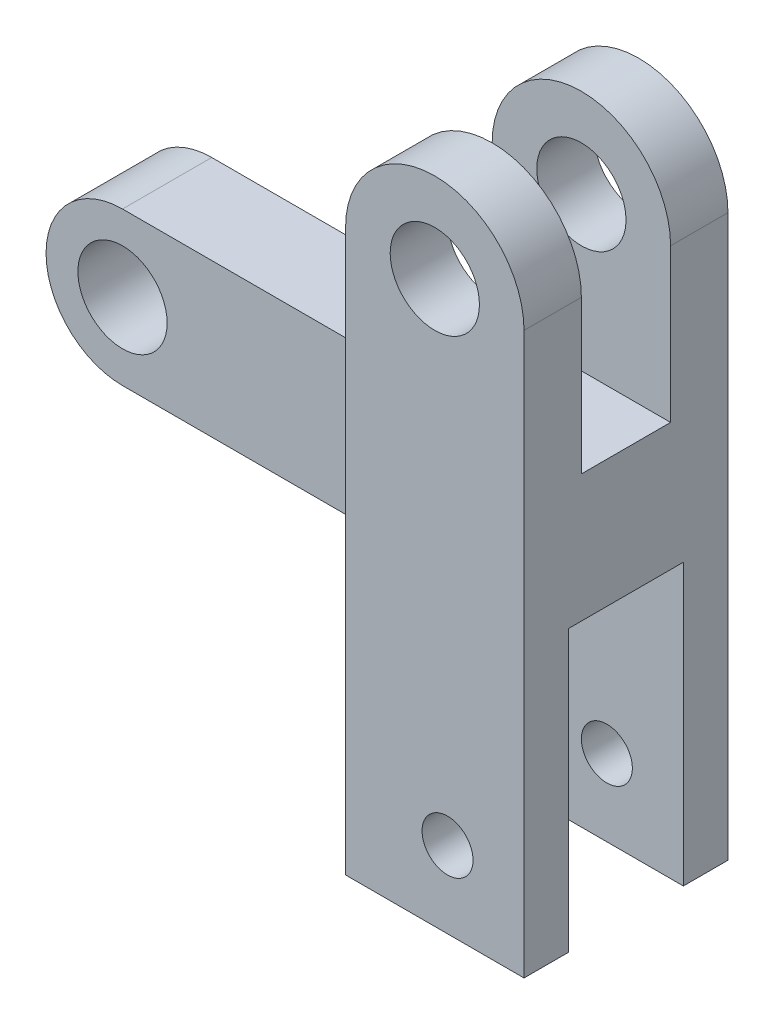
ISO-10303-21;
HEADER;
FILE_DESCRIPTION(('STEP AP214'),'2;1');
FILE_NAME('part.step','',(''),(''),'','','');
FILE_SCHEMA(('AUTOMOTIVE_DESIGN { 1 0 10303 214 1 1 1 1 }'));
ENDSEC;
DATA;
#1=APPLICATION_CONTEXT('core data for automotive mechanical design processes');
#2=APPLICATION_PROTOCOL_DEFINITION('international standard','automotive_design',2000,#1);
#3=PRODUCT_CONTEXT('',#1,'mechanical');
#4=PRODUCT('Part','Part','',(#3));
#5=PRODUCT_RELATED_PRODUCT_CATEGORY('part','',(#4));
#6=PRODUCT_DEFINITION_FORMATION('','',#4);
#7=PRODUCT_DEFINITION_CONTEXT('part definition',#1,'design');
#8=PRODUCT_DEFINITION('design','',#6,#7);
#9=PRODUCT_DEFINITION_SHAPE('','',#8);
#10=(LENGTH_UNIT() NAMED_UNIT(*) SI_UNIT(.MILLI.,.METRE.));
#11=(NAMED_UNIT(*) PLANE_ANGLE_UNIT() SI_UNIT($,.RADIAN.));
#12=(NAMED_UNIT(*) SI_UNIT($,.STERADIAN.) SOLID_ANGLE_UNIT());
#13=UNCERTAINTY_MEASURE_WITH_UNIT(LENGTH_MEASURE(1.E-05),#10,'distance_accuracy_value','');
#14=(GEOMETRIC_REPRESENTATION_CONTEXT(3) GLOBAL_UNCERTAINTY_ASSIGNED_CONTEXT((#13)) GLOBAL_UNIT_ASSIGNED_CONTEXT((#10,
#11,#12)) REPRESENTATION_CONTEXT('',''));
#15=CARTESIAN_POINT('',(0.,0.,0.));
#16=DIRECTION('',(0.,0.,1.));
#17=DIRECTION('',(1.,0.,0.));
#18=AXIS2_PLACEMENT_3D('',#15,#16,#17);
#19=CARTESIAN_POINT('',(0.,2.4,-3.5));
#20=DIRECTION('',(1.,0.,0.));
#21=DIRECTION('',(0.,0.,-1.));
#22=AXIS2_PLACEMENT_3D('',#19,#20,#21);
#23=PLANE('',#22);
#24=DIRECTION('',(0.,-1.,0.));
#25=VECTOR('',#24,1.);
#26=CARTESIAN_POINT('',(0.,-0.999999999999997,2.25));
#27=LINE('',#26,#25);
#28=CARTESIAN_POINT('',(0.,-0.999999999999997,2.25));
#29=VERTEX_POINT('',#28);
#30=CARTESIAN_POINT('',(0.,-12.,2.25));
#31=VERTEX_POINT('',#30);
#32=EDGE_CURVE('E239',#29,#31,#27,.T.);
#33=ORIENTED_EDGE('',*,*,#32,.T.);
#34=DIRECTION('',(0.,0.,-1.));
#35=VECTOR('',#34,1.);
#36=CARTESIAN_POINT('',(0.,-12.,3.5));
#37=LINE('',#36,#35);
#38=CARTESIAN_POINT('',(0.,-12.,4.));
#39=VERTEX_POINT('',#38);
#40=EDGE_CURVE('E278',#39,#31,#37,.T.);
#41=ORIENTED_EDGE('',*,*,#40,.F.);
#42=DIRECTION('',(0.,-1.,0.));
#43=VECTOR('',#42,1.);
#44=CARTESIAN_POINT('',(0.,10.,4.));
#45=LINE('',#44,#43);
#46=CARTESIAN_POINT('',(0.,10.,4.));
#47=VERTEX_POINT('',#46);
#48=EDGE_CURVE('E212',#47,#39,#45,.T.);
#49=ORIENTED_EDGE('',*,*,#48,.F.);
#50=DIRECTION('',(0.,0.,1.));
#51=VECTOR('',#50,1.);
#52=CARTESIAN_POINT('',(0.,10.,1.75));
#53=LINE('',#52,#51);
#54=CARTESIAN_POINT('',(0.,10.,1.75));
#55=VERTEX_POINT('',#54);
#56=EDGE_CURVE('E296',#55,#47,#53,.T.);
#57=ORIENTED_EDGE('',*,*,#56,.F.);
#58=DIRECTION('',(0.,1.,0.));
#59=VECTOR('',#58,1.);
#60=CARTESIAN_POINT('',(0.,0.,1.75));
#61=LINE('',#60,#59);
#62=CARTESIAN_POINT('',(0.,4.,1.75));
#63=VERTEX_POINT('',#62);
#64=EDGE_CURVE('E285',#63,#55,#61,.T.);
#65=ORIENTED_EDGE('',*,*,#64,.F.);
#66=CARTESIAN_POINT('',(0.,-0.999999999999997,1.75));
#67=VERTEX_POINT('',#66);
#68=EDGE_CURVE('E290',#67,#63,#61,.T.);
#69=ORIENTED_EDGE('',*,*,#68,.F.);
#70=DIRECTION('',(0.,0.,1.));
#71=VECTOR('',#70,1.);
#72=CARTESIAN_POINT('',(0.,-0.999999999999997,2.25));
#73=LINE('',#72,#71);
#74=EDGE_CURVE('E221',#67,#29,#73,.T.);
#75=ORIENTED_EDGE('',*,*,#74,.T.);
#76=EDGE_LOOP('',(#33,#41,#49,#57,#65,#69,#75));
#77=FACE_BOUND('',#76,.T.);
#78=ADVANCED_FACE('F45',(#77),#23,.F.);
#79=DIRECTION('',(0.,-1.,0.));
#80=VECTOR('',#79,1.);
#81=CARTESIAN_POINT('',(0.,-0.999999999999997,-2.25));
#82=LINE('',#81,#80);
#83=CARTESIAN_POINT('',(0.,-0.999999999999997,-2.25));
#84=VERTEX_POINT('',#83);
#85=CARTESIAN_POINT('',(0.,-12.,-2.25));
#86=VERTEX_POINT('',#85);
#87=EDGE_CURVE('E228',#84,#86,#82,.T.);
#88=ORIENTED_EDGE('',*,*,#87,.F.);
#89=CARTESIAN_POINT('',(0.,-0.999999999999997,-1.75));
#90=VERTEX_POINT('',#89);
#91=EDGE_CURVE('E216',#84,#90,#73,.T.);
#92=ORIENTED_EDGE('',*,*,#91,.T.);
#93=DIRECTION('',(0.,1.,0.));
#94=VECTOR('',#93,1.);
#95=CARTESIAN_POINT('',(0.,0.,-1.75));
#96=LINE('',#95,#94);
#97=CARTESIAN_POINT('',(0.,4.,-1.75));
#98=VERTEX_POINT('',#97);
#99=EDGE_CURVE('E301',#90,#98,#96,.T.);
#100=ORIENTED_EDGE('',*,*,#99,.T.);
#101=CARTESIAN_POINT('',(0.,10.,-1.75));
#102=VERTEX_POINT('',#101);
#103=EDGE_CURVE('E298',#98,#102,#96,.T.);
#104=ORIENTED_EDGE('',*,*,#103,.T.);
#105=DIRECTION('',(0.,0.,-1.));
#106=VECTOR('',#105,1.);
#107=CARTESIAN_POINT('',(0.,10.,-1.75));
#108=LINE('',#107,#106);
#109=CARTESIAN_POINT('',(0.,10.,-4.));
#110=VERTEX_POINT('',#109);
#111=EDGE_CURVE('E169',#102,#110,#108,.T.);
#112=ORIENTED_EDGE('',*,*,#111,.T.);
#113=DIRECTION('',(0.,1.,0.));
#114=VECTOR('',#113,1.);
#115=CARTESIAN_POINT('',(0.,-12.,-4.));
#116=LINE('',#115,#114);
#117=CARTESIAN_POINT('',(0.,-12.,-4.));
#118=VERTEX_POINT('',#117);
#119=EDGE_CURVE('E187',#118,#110,#116,.T.);
#120=ORIENTED_EDGE('',*,*,#119,.F.);
#121=EDGE_CURVE('E277',#86,#118,#37,.T.);
#122=ORIENTED_EDGE('',*,*,#121,.F.);
#123=EDGE_LOOP('',(#88,#92,#100,#104,#112,#120,#122));
#124=FACE_BOUND('',#123,.T.);
#125=ADVANCED_FACE('F368',(#124),#23,.F.);
#126=CARTESIAN_POINT('',(7.,2.4,-3.5));
#127=DIRECTION('',(-1.,0.,0.));
#128=DIRECTION('',(0.,0.,1.));
#129=AXIS2_PLACEMENT_3D('',#126,#127,#128);
#130=PLANE('',#129);
#131=DIRECTION('',(0.,-1.,0.));
#132=VECTOR('',#131,1.);
#133=CARTESIAN_POINT('',(7.,-0.999999999999997,2.25));
#134=LINE('',#133,#132);
#135=CARTESIAN_POINT('',(7.,-0.999999999999997,2.25));
#136=VERTEX_POINT('',#135);
#137=CARTESIAN_POINT('',(7.,-12.,2.25));
#138=VERTEX_POINT('',#137);
#139=EDGE_CURVE('E237',#136,#138,#134,.T.);
#140=ORIENTED_EDGE('',*,*,#139,.F.);
#141=DIRECTION('',(0.,0.,-1.));
#142=VECTOR('',#141,1.);
#143=CARTESIAN_POINT('',(7.,-0.999999999999997,2.25));
#144=LINE('',#143,#142);
#145=CARTESIAN_POINT('',(7.,-0.999999999999997,-2.25));
#146=VERTEX_POINT('',#145);
#147=EDGE_CURVE('E223',#136,#146,#144,.T.);
#148=ORIENTED_EDGE('',*,*,#147,.T.);
#149=DIRECTION('',(0.,-1.,0.));
#150=VECTOR('',#149,1.);
#151=CARTESIAN_POINT('',(7.,-0.999999999999997,-2.25));
#152=LINE('',#151,#150);
#153=CARTESIAN_POINT('',(7.,-12.,-2.25));
#154=VERTEX_POINT('',#153);
#155=EDGE_CURVE('E235',#146,#154,#152,.T.);
#156=ORIENTED_EDGE('',*,*,#155,.T.);
#157=DIRECTION('',(0.,0.,1.));
#158=VECTOR('',#157,1.);
#159=CARTESIAN_POINT('',(7.,-12.,-3.5));
#160=LINE('',#159,#158);
#161=CARTESIAN_POINT('',(7.,-12.,-4.));
#162=VERTEX_POINT('',#161);
#163=EDGE_CURVE('E177',#162,#154,#160,.T.);
#164=ORIENTED_EDGE('',*,*,#163,.F.);
#165=DIRECTION('',(0.,-1.,0.));
#166=VECTOR('',#165,1.);
#167=CARTESIAN_POINT('',(7.,10.,-4.));
#168=LINE('',#167,#166);
#169=CARTESIAN_POINT('',(7.,10.,-4.));
#170=VERTEX_POINT('',#169);
#171=EDGE_CURVE('E172',#170,#162,#168,.T.);
#172=ORIENTED_EDGE('',*,*,#171,.F.);
#173=DIRECTION('',(0.,0.,-1.));
#174=VECTOR('',#173,1.);
#175=CARTESIAN_POINT('',(7.,10.,-1.75));
#176=LINE('',#175,#174);
#177=CARTESIAN_POINT('',(7.,10.,-1.75));
#178=VERTEX_POINT('',#177);
#179=EDGE_CURVE('E53',#178,#170,#176,.T.);
#180=ORIENTED_EDGE('',*,*,#179,.F.);
#181=DIRECTION('',(0.,-1.,0.));
#182=VECTOR('',#181,1.);
#183=CARTESIAN_POINT('',(7.,0.,-1.75));
#184=LINE('',#183,#182);
#185=CARTESIAN_POINT('',(7.,4.,-1.75));
#186=VERTEX_POINT('',#185);
#187=EDGE_CURVE('E303',#178,#186,#184,.T.);
#188=ORIENTED_EDGE('',*,*,#187,.T.);
#189=DIRECTION('',(0.,0.,-1.));
#190=VECTOR('',#189,1.);
#191=CARTESIAN_POINT('',(7.,4.,1.75));
#192=LINE('',#191,#190);
#193=CARTESIAN_POINT('',(7.,4.,1.75));
#194=VERTEX_POINT('',#193);
#195=EDGE_CURVE('E269',#194,#186,#192,.T.);
#196=ORIENTED_EDGE('',*,*,#195,.F.);
#197=DIRECTION('',(0.,-1.,0.));
#198=VECTOR('',#197,1.);
#199=CARTESIAN_POINT('',(7.,0.,1.75));
#200=LINE('',#199,#198);
#201=CARTESIAN_POINT('',(7.,10.,1.75));
#202=VERTEX_POINT('',#201);
#203=EDGE_CURVE('E292',#202,#194,#200,.T.);
#204=ORIENTED_EDGE('',*,*,#203,.F.);
#205=DIRECTION('',(0.,0.,1.));
#206=VECTOR('',#205,1.);
#207=CARTESIAN_POINT('',(7.,10.,1.75));
#208=LINE('',#207,#206);
#209=CARTESIAN_POINT('',(7.,10.,4.));
#210=VERTEX_POINT('',#209);
#211=EDGE_CURVE('E294',#202,#210,#208,.T.);
#212=ORIENTED_EDGE('',*,*,#211,.T.);
#213=DIRECTION('',(0.,1.,0.));
#214=VECTOR('',#213,1.);
#215=CARTESIAN_POINT('',(7.,-12.,4.));
#216=LINE('',#215,#214);
#217=CARTESIAN_POINT('',(7.,-12.,4.));
#218=VERTEX_POINT('',#217);
#219=EDGE_CURVE('E206',#218,#210,#216,.T.);
#220=ORIENTED_EDGE('',*,*,#219,.F.);
#221=EDGE_CURVE('E275',#138,#218,#160,.T.);
#222=ORIENTED_EDGE('',*,*,#221,.F.);
#223=EDGE_LOOP('',(#140,#148,#156,#164,#172,#180,#188,#196,#204,#212,#220,#222));
#224=FACE_BOUND('',#223,.T.);
#225=ADVANCED_FACE('F174',(#224),#130,.F.);
#226=CARTESIAN_POINT('',(0.,-12.,0.));
#227=DIRECTION('',(0.,-1.,0.));
#228=DIRECTION('',(0.,0.,-1.));
#229=AXIS2_PLACEMENT_3D('',#226,#227,#228);
#230=PLANE('',#229);
#231=ORIENTED_EDGE('',*,*,#40,.T.);
#232=DIRECTION('',(1.,0.,0.));
#233=VECTOR('',#232,1.);
#234=CARTESIAN_POINT('',(0.,-12.,2.25));
#235=LINE('',#234,#233);
#236=EDGE_CURVE('E215',#31,#138,#235,.T.);
#237=ORIENTED_EDGE('',*,*,#236,.T.);
#238=ORIENTED_EDGE('',*,*,#221,.T.);
#239=DIRECTION('',(1.,0.,0.));
#240=VECTOR('',#239,1.);
#241=CARTESIAN_POINT('',(0.,-12.,4.));
#242=LINE('',#241,#240);
#243=EDGE_CURVE('E203',#39,#218,#242,.T.);
#244=ORIENTED_EDGE('',*,*,#243,.F.);
#245=EDGE_LOOP('',(#231,#237,#238,#244));
#246=FACE_BOUND('',#245,.T.);
#247=ADVANCED_FACE('F330',(#246),#230,.T.);
#248=ORIENTED_EDGE('',*,*,#163,.T.);
#249=DIRECTION('',(-1.,0.,0.));
#250=VECTOR('',#249,1.);
#251=CARTESIAN_POINT('',(0.,-12.,-2.25));
#252=LINE('',#251,#250);
#253=EDGE_CURVE('E231',#154,#86,#252,.T.);
#254=ORIENTED_EDGE('',*,*,#253,.T.);
#255=ORIENTED_EDGE('',*,*,#121,.T.);
#256=DIRECTION('',(-1.,0.,0.));
#257=VECTOR('',#256,1.);
#258=CARTESIAN_POINT('',(7.,-12.,-4.));
#259=LINE('',#258,#257);
#260=EDGE_CURVE('E181',#162,#118,#259,.T.);
#261=ORIENTED_EDGE('',*,*,#260,.F.);
#262=EDGE_LOOP('',(#248,#254,#255,#261));
#263=FACE_BOUND('',#262,.T.);
#264=ADVANCED_FACE('F379',(#263),#230,.T.);
#265=CARTESIAN_POINT('',(4.,-9.,-3.5));
#266=DIRECTION('',(0.,0.,1.));
#267=DIRECTION('',(1.,0.,0.));
#268=AXIS2_PLACEMENT_3D('',#265,#266,#267);
#269=CYLINDRICAL_SURFACE('',#268,1.);
#270=CARTESIAN_POINT('',(4.,-9.,2.25));
#271=DIRECTION('',(0.,0.,-1.));
#272=DIRECTION('',(-1.,0.,0.));
#273=AXIS2_PLACEMENT_3D('',#270,#271,#272);
#274=CIRCLE('',#273,1.);
#275=CARTESIAN_POINT('',(3.,-9.,2.25));
#276=VERTEX_POINT('',#275);
#277=EDGE_CURVE('E48',#276,#276,#274,.T.);
#278=ORIENTED_EDGE('',*,*,#277,.T.);
#279=EDGE_LOOP('',(#278));
#280=FACE_BOUND('',#279,.T.);
#281=CARTESIAN_POINT('',(4.,-9.,4.));
#282=DIRECTION('',(0.,0.,1.));
#283=DIRECTION('',(1.,0.,0.));
#284=AXIS2_PLACEMENT_3D('',#281,#282,#283);
#285=CIRCLE('',#284,1.);
#286=CARTESIAN_POINT('',(5.,-9.,4.));
#287=VERTEX_POINT('',#286);
#288=EDGE_CURVE('E200',#287,#287,#285,.T.);
#289=ORIENTED_EDGE('',*,*,#288,.T.);
#290=EDGE_LOOP('',(#289));
#291=FACE_BOUND('',#290,.T.);
#292=ADVANCED_FACE('F313',(#280,#291),#269,.F.);
#293=CARTESIAN_POINT('',(4.,-9.,-2.25));
#294=DIRECTION('',(0.,0.,1.));
#295=DIRECTION('',(1.,0.,0.));
#296=AXIS2_PLACEMENT_3D('',#293,#294,#295);
#297=CIRCLE('',#296,1.);
#298=CARTESIAN_POINT('',(5.,-9.,-2.25));
#299=VERTEX_POINT('',#298);
#300=EDGE_CURVE('E242',#299,#299,#297,.T.);
#301=ORIENTED_EDGE('',*,*,#300,.T.);
#302=EDGE_LOOP('',(#301));
#303=FACE_BOUND('',#302,.T.);
#304=CARTESIAN_POINT('',(4.,-9.,-4.));
#305=DIRECTION('',(0.,0.,-1.));
#306=DIRECTION('',(-1.,0.,0.));
#307=AXIS2_PLACEMENT_3D('',#304,#305,#306);
#308=CIRCLE('',#307,0.999999999999997);
#309=CARTESIAN_POINT('',(3.,-9.,-4.));
#310=VERTEX_POINT('',#309);
#311=EDGE_CURVE('E188',#310,#310,#308,.T.);
#312=ORIENTED_EDGE('',*,*,#311,.T.);
#313=EDGE_LOOP('',(#312));
#314=FACE_BOUND('',#313,.T.);
#315=ADVANCED_FACE('F387',(#303,#314),#269,.F.);
#316=CARTESIAN_POINT('',(3.5,10.,-1.75));
#317=DIRECTION('',(0.,0.,-1.));
#318=DIRECTION('',(-1.,0.,0.));
#319=AXIS2_PLACEMENT_3D('',#316,#317,#318);
#320=CYLINDRICAL_SURFACE('',#319,3.5);
#321=ORIENTED_EDGE('',*,*,#179,.T.);
#322=CARTESIAN_POINT('',(3.5,10.,-4.));
#323=DIRECTION('',(0.,0.,-1.));
#324=DIRECTION('',(-1.,0.,0.));
#325=AXIS2_PLACEMENT_3D('',#322,#323,#324);
#326=CIRCLE('',#325,3.5);
#327=EDGE_CURVE('E165',#110,#170,#326,.T.);
#328=ORIENTED_EDGE('',*,*,#327,.F.);
#329=ORIENTED_EDGE('',*,*,#111,.F.);
#330=CARTESIAN_POINT('',(3.5,10.,-1.75));
#331=DIRECTION('',(0.,0.,-1.));
#332=DIRECTION('',(-1.,0.,0.));
#333=AXIS2_PLACEMENT_3D('',#330,#331,#332);
#334=CIRCLE('',#333,3.5);
#335=EDGE_CURVE('E167',#102,#178,#334,.T.);
#336=ORIENTED_EDGE('',*,*,#335,.T.);
#337=EDGE_LOOP('',(#321,#328,#329,#336));
#338=FACE_BOUND('',#337,.T.);
#339=ADVANCED_FACE('F162',(#338),#320,.T.);
#340=CARTESIAN_POINT('',(0.,0.,-1.75));
#341=DIRECTION('',(0.,0.,-1.));
#342=DIRECTION('',(-1.,0.,0.));
#343=AXIS2_PLACEMENT_3D('',#340,#341,#342);
#344=PLANE('',#343);
#345=CARTESIAN_POINT('',(3.5,10.,-1.75));
#346=DIRECTION('',(0.,0.,-1.));
#347=DIRECTION('',(-1.,0.,0.));
#348=AXIS2_PLACEMENT_3D('',#345,#346,#347);
#349=CIRCLE('',#348,1.75);
#350=CARTESIAN_POINT('',(1.75,10.,-1.75));
#351=VERTEX_POINT('',#350);
#352=EDGE_CURVE('E282',#351,#351,#349,.T.);
#353=ORIENTED_EDGE('',*,*,#352,.T.);
#354=EDGE_LOOP('',(#353));
#355=FACE_BOUND('',#354,.T.);
#356=ORIENTED_EDGE('',*,*,#103,.F.);
#357=DIRECTION('',(1.,0.,0.));
#358=VECTOR('',#357,1.);
#359=CARTESIAN_POINT('',(0.,4.,-1.75));
#360=LINE('',#359,#358);
#361=EDGE_CURVE('E69',#98,#186,#360,.T.);
#362=ORIENTED_EDGE('',*,*,#361,.T.);
#363=ORIENTED_EDGE('',*,*,#187,.F.);
#364=ORIENTED_EDGE('',*,*,#335,.F.);
#365=EDGE_LOOP('',(#356,#362,#363,#364));
#366=FACE_BOUND('',#365,.T.);
#367=ADVANCED_FACE('F369',(#355,#366),#344,.F.);
#368=CARTESIAN_POINT('',(3.5,10.,1.75));
#369=DIRECTION('',(0.,0.,1.));
#370=DIRECTION('',(1.,0.,0.));
#371=AXIS2_PLACEMENT_3D('',#368,#369,#370);
#372=CYLINDRICAL_SURFACE('',#371,3.5);
#373=ORIENTED_EDGE('',*,*,#56,.T.);
#374=CARTESIAN_POINT('',(3.5,10.,4.));
#375=DIRECTION('',(0.,0.,1.));
#376=DIRECTION('',(1.,0.,0.));
#377=AXIS2_PLACEMENT_3D('',#374,#375,#376);
#378=CIRCLE('',#377,3.5);
#379=EDGE_CURVE('E209',#210,#47,#378,.T.);
#380=ORIENTED_EDGE('',*,*,#379,.F.);
#381=ORIENTED_EDGE('',*,*,#211,.F.);
#382=CARTESIAN_POINT('',(3.5,10.,1.75));
#383=DIRECTION('',(0.,0.,-1.));
#384=DIRECTION('',(-1.,0.,0.));
#385=AXIS2_PLACEMENT_3D('',#382,#383,#384);
#386=CIRCLE('',#385,3.5);
#387=EDGE_CURVE('E289',#55,#202,#386,.T.);
#388=ORIENTED_EDGE('',*,*,#387,.F.);
#389=EDGE_LOOP('',(#373,#380,#381,#388));
#390=FACE_BOUND('',#389,.T.);
#391=ADVANCED_FACE('F340',(#390),#372,.T.);
#392=CARTESIAN_POINT('',(0.,0.,1.75));
#393=DIRECTION('',(0.,0.,-1.));
#394=DIRECTION('',(-1.,0.,0.));
#395=AXIS2_PLACEMENT_3D('',#392,#393,#394);
#396=PLANE('',#395);
#397=DIRECTION('',(1.,0.,0.));
#398=VECTOR('',#397,1.);
#399=CARTESIAN_POINT('',(0.,4.,1.75));
#400=LINE('',#399,#398);
#401=EDGE_CURVE('E12',#63,#194,#400,.T.);
#402=ORIENTED_EDGE('',*,*,#401,.F.);
#403=ORIENTED_EDGE('',*,*,#64,.T.);
#404=ORIENTED_EDGE('',*,*,#387,.T.);
#405=ORIENTED_EDGE('',*,*,#203,.T.);
#406=EDGE_LOOP('',(#402,#403,#404,#405));
#407=FACE_BOUND('',#406,.T.);
#408=CARTESIAN_POINT('',(3.5,10.,1.75));
#409=DIRECTION('',(0.,0.,-1.));
#410=DIRECTION('',(-1.,0.,0.));
#411=AXIS2_PLACEMENT_3D('',#408,#409,#410);
#412=CIRCLE('',#411,1.75);
#413=CARTESIAN_POINT('',(1.75,10.,1.75));
#414=VERTEX_POINT('',#413);
#415=EDGE_CURVE('E281',#414,#414,#412,.T.);
#416=ORIENTED_EDGE('',*,*,#415,.F.);
#417=EDGE_LOOP('',(#416));
#418=FACE_BOUND('',#417,.T.);
#419=ADVANCED_FACE('F345',(#407,#418),#396,.T.);
#420=CARTESIAN_POINT('',(3.5,10.,3.5));
#421=DIRECTION('',(0.,0.,-1.));
#422=DIRECTION('',(-1.,0.,0.));
#423=AXIS2_PLACEMENT_3D('',#420,#421,#422);
#424=CYLINDRICAL_SURFACE('',#423,1.75);
#425=ORIENTED_EDGE('',*,*,#415,.T.);
#426=EDGE_LOOP('',(#425));
#427=FACE_BOUND('',#426,.T.);
#428=CARTESIAN_POINT('',(3.5,10.,4.));
#429=DIRECTION('',(0.,0.,1.));
#430=DIRECTION('',(1.,0.,0.));
#431=AXIS2_PLACEMENT_3D('',#428,#429,#430);
#432=CIRCLE('',#431,1.75);
#433=CARTESIAN_POINT('',(5.25,10.,4.));
#434=VERTEX_POINT('',#433);
#435=EDGE_CURVE('E197',#434,#434,#432,.T.);
#436=ORIENTED_EDGE('',*,*,#435,.T.);
#437=EDGE_LOOP('',(#436));
#438=FACE_BOUND('',#437,.T.);
#439=ADVANCED_FACE('F411',(#427,#438),#424,.F.);
#440=ORIENTED_EDGE('',*,*,#352,.F.);
#441=EDGE_LOOP('',(#440));
#442=FACE_BOUND('',#441,.T.);
#443=CARTESIAN_POINT('',(3.5,10.,-4.));
#444=DIRECTION('',(0.,0.,-1.));
#445=DIRECTION('',(-1.,0.,0.));
#446=AXIS2_PLACEMENT_3D('',#443,#444,#445);
#447=CIRCLE('',#446,1.75);
#448=CARTESIAN_POINT('',(1.75,10.,-4.));
#449=VERTEX_POINT('',#448);
#450=EDGE_CURVE('E191',#449,#449,#447,.T.);
#451=ORIENTED_EDGE('',*,*,#450,.T.);
#452=EDGE_LOOP('',(#451));
#453=FACE_BOUND('',#452,.T.);
#454=ADVANCED_FACE('F413',(#442,#453),#424,.F.);
#455=CARTESIAN_POINT('',(0.,-2.,1.75));
#456=DIRECTION('',(0.,1.,0.));
#457=DIRECTION('',(0.,0.,1.));
#458=AXIS2_PLACEMENT_3D('',#455,#456,#457);
#459=PLANE('',#458);
#460=DIRECTION('',(1.,0.,0.));
#461=VECTOR('',#460,1.);
#462=CARTESIAN_POINT('',(0.,-2.,-1.75));
#463=LINE('',#462,#461);
#464=CARTESIAN_POINT('',(-11.,-2.,-1.75));
#465=VERTEX_POINT('',#464);
#466=CARTESIAN_POINT('',(0.,-2.,-1.75));
#467=VERTEX_POINT('',#466);
#468=EDGE_CURVE('E263',#465,#467,#463,.T.);
#469=ORIENTED_EDGE('',*,*,#468,.T.);
#470=DIRECTION('',(0.,0.,1.));
#471=VECTOR('',#470,1.);
#472=CARTESIAN_POINT('',(0.,-2.,-3.5));
#473=LINE('',#472,#471);
#474=CARTESIAN_POINT('',(0.,-2.,1.75));
#475=VERTEX_POINT('',#474);
#476=EDGE_CURVE('E61',#467,#475,#473,.T.);
#477=ORIENTED_EDGE('',*,*,#476,.T.);
#478=DIRECTION('',(1.,0.,0.));
#479=VECTOR('',#478,1.);
#480=CARTESIAN_POINT('',(0.,-2.,1.75));
#481=LINE('',#480,#479);
#482=CARTESIAN_POINT('',(-11.,-2.,1.75));
#483=VERTEX_POINT('',#482);
#484=EDGE_CURVE('E250',#483,#475,#481,.T.);
#485=ORIENTED_EDGE('',*,*,#484,.F.);
#486=DIRECTION('',(0.,0.,-1.));
#487=VECTOR('',#486,1.);
#488=CARTESIAN_POINT('',(-11.,-2.,1.75));
#489=LINE('',#488,#487);
#490=EDGE_CURVE('E272',#483,#465,#489,.T.);
#491=ORIENTED_EDGE('',*,*,#490,.T.);
#492=EDGE_LOOP('',(#469,#477,#485,#491));
#493=FACE_BOUND('',#492,.T.);
#494=ADVANCED_FACE('F355',(#493),#459,.F.);
#495=CARTESIAN_POINT('',(0.,0.,1.75));
#496=DIRECTION('',(0.,0.,1.));
#497=DIRECTION('',(1.,0.,0.));
#498=AXIS2_PLACEMENT_3D('',#495,#496,#497);
#499=PLANE('',#498);
#500=CARTESIAN_POINT('',(-11.,1.,1.75));
#501=DIRECTION('',(0.,0.,1.));
#502=DIRECTION('',(1.,0.,0.));
#503=AXIS2_PLACEMENT_3D('',#500,#501,#502);
#504=CIRCLE('',#503,1.75);
#505=CARTESIAN_POINT('',(-9.25,1.,1.75));
#506=VERTEX_POINT('',#505);
#507=EDGE_CURVE('E243',#506,#506,#504,.T.);
#508=ORIENTED_EDGE('',*,*,#507,.F.);
#509=EDGE_LOOP('',(#508));
#510=FACE_BOUND('',#509,.T.);
#511=EDGE_CURVE('E286',#475,#67,#61,.T.);
#512=ORIENTED_EDGE('',*,*,#511,.T.);
#513=ORIENTED_EDGE('',*,*,#68,.T.);
#514=DIRECTION('',(1.,0.,0.));
#515=VECTOR('',#514,1.);
#516=CARTESIAN_POINT('',(0.,4.,1.75));
#517=LINE('',#516,#515);
#518=CARTESIAN_POINT('',(-11.,4.,1.75));
#519=VERTEX_POINT('',#518);
#520=EDGE_CURVE('E253',#519,#63,#517,.T.);
#521=ORIENTED_EDGE('',*,*,#520,.F.);
#522=CARTESIAN_POINT('',(-11.,1.,1.75));
#523=DIRECTION('',(0.,0.,1.));
#524=DIRECTION('',(1.,0.,0.));
#525=AXIS2_PLACEMENT_3D('',#522,#523,#524);
#526=CIRCLE('',#525,3.);
#527=EDGE_CURVE('E246',#483,#519,#526,.F.);
#528=ORIENTED_EDGE('',*,*,#527,.F.);
#529=ORIENTED_EDGE('',*,*,#484,.T.);
#530=EDGE_LOOP('',(#512,#513,#521,#528,#529));
#531=FACE_BOUND('',#530,.T.);
#532=ADVANCED_FACE('F349',(#510,#531),#499,.T.);
#533=CARTESIAN_POINT('',(0.,0.,-1.75));
#534=DIRECTION('',(0.,0.,1.));
#535=DIRECTION('',(1.,0.,0.));
#536=AXIS2_PLACEMENT_3D('',#533,#534,#535);
#537=PLANE('',#536);
#538=CARTESIAN_POINT('',(-11.,1.,-1.75));
#539=DIRECTION('',(0.,0.,1.));
#540=DIRECTION('',(1.,0.,0.));
#541=AXIS2_PLACEMENT_3D('',#538,#539,#540);
#542=CIRCLE('',#541,1.75);
#543=CARTESIAN_POINT('',(-9.25,1.,-1.75));
#544=VERTEX_POINT('',#543);
#545=EDGE_CURVE('E257',#544,#544,#542,.T.);
#546=ORIENTED_EDGE('',*,*,#545,.T.);
#547=EDGE_LOOP('',(#546));
#548=FACE_BOUND('',#547,.T.);
#549=CARTESIAN_POINT('',(-11.,4.,-1.75));
#550=VERTEX_POINT('',#549);
#551=EDGE_CURVE('E247',#550,#98,#360,.T.);
#552=ORIENTED_EDGE('',*,*,#551,.T.);
#553=ORIENTED_EDGE('',*,*,#99,.F.);
#554=EDGE_CURVE('E299',#467,#90,#96,.T.);
#555=ORIENTED_EDGE('',*,*,#554,.F.);
#556=ORIENTED_EDGE('',*,*,#468,.F.);
#557=CARTESIAN_POINT('',(-11.,1.,-1.75));
#558=DIRECTION('',(0.,0.,1.));
#559=DIRECTION('',(1.,0.,0.));
#560=AXIS2_PLACEMENT_3D('',#557,#558,#559);
#561=CIRCLE('',#560,3.);
#562=EDGE_CURVE('E260',#465,#550,#561,.F.);
#563=ORIENTED_EDGE('',*,*,#562,.T.);
#564=EDGE_LOOP('',(#552,#553,#555,#556,#563));
#565=FACE_BOUND('',#564,.T.);
#566=ADVANCED_FACE('F359',(#548,#565),#537,.F.);
#567=CARTESIAN_POINT('',(-11.,1.,1.75));
#568=DIRECTION('',(0.,0.,-1.));
#569=DIRECTION('',(-1.,0.,0.));
#570=AXIS2_PLACEMENT_3D('',#567,#568,#569);
#571=CYLINDRICAL_SURFACE('',#570,3.);
#572=ORIENTED_EDGE('',*,*,#562,.F.);
#573=ORIENTED_EDGE('',*,*,#490,.F.);
#574=ORIENTED_EDGE('',*,*,#527,.T.);
#575=DIRECTION('',(0.,0.,-1.));
#576=VECTOR('',#575,1.);
#577=CARTESIAN_POINT('',(-11.,4.,1.75));
#578=LINE('',#577,#576);
#579=EDGE_CURVE('E256',#519,#550,#578,.T.);
#580=ORIENTED_EDGE('',*,*,#579,.T.);
#581=EDGE_LOOP('',(#572,#573,#574,#580));
#582=FACE_BOUND('',#581,.T.);
#583=ADVANCED_FACE('F363',(#582),#571,.T.);
#584=CARTESIAN_POINT('',(-11.,1.,1.75));
#585=DIRECTION('',(0.,0.,-1.));
#586=DIRECTION('',(-1.,0.,0.));
#587=AXIS2_PLACEMENT_3D('',#584,#585,#586);
#588=CYLINDRICAL_SURFACE('',#587,1.75);
#589=ORIENTED_EDGE('',*,*,#507,.T.);
#590=EDGE_LOOP('',(#589));
#591=FACE_BOUND('',#590,.T.);
#592=ORIENTED_EDGE('',*,*,#545,.F.);
#593=EDGE_LOOP('',(#592));
#594=FACE_BOUND('',#593,.T.);
#595=ADVANCED_FACE('F445',(#591,#594),#588,.F.);
#596=CARTESIAN_POINT('',(0.,4.,1.75));
#597=DIRECTION('',(0.,1.,0.));
#598=DIRECTION('',(0.,0.,1.));
#599=AXIS2_PLACEMENT_3D('',#596,#597,#598);
#600=PLANE('',#599);
#601=ORIENTED_EDGE('',*,*,#551,.F.);
#602=ORIENTED_EDGE('',*,*,#579,.F.);
#603=ORIENTED_EDGE('',*,*,#520,.T.);
#604=ORIENTED_EDGE('',*,*,#401,.T.);
#605=ORIENTED_EDGE('',*,*,#195,.T.);
#606=ORIENTED_EDGE('',*,*,#361,.F.);
#607=EDGE_LOOP('',(#601,#602,#603,#604,#605,#606));
#608=FACE_BOUND('',#607,.T.);
#609=ADVANCED_FACE('F365',(#608),#600,.T.);
#610=CARTESIAN_POINT('',(0.,-0.999999999999997,2.25));
#611=DIRECTION('',(1.,0.,0.));
#612=DIRECTION('',(0.,0.,-1.));
#613=AXIS2_PLACEMENT_3D('',#610,#611,#612);
#614=PLANE('',#613);
#615=ORIENTED_EDGE('',*,*,#476,.F.);
#616=ORIENTED_EDGE('',*,*,#554,.T.);
#617=EDGE_CURVE('E220',#90,#67,#73,.T.);
#618=ORIENTED_EDGE('',*,*,#617,.T.);
#619=ORIENTED_EDGE('',*,*,#511,.F.);
#620=EDGE_LOOP('',(#615,#616,#618,#619));
#621=FACE_BOUND('',#620,.T.);
#622=ADVANCED_FACE('F320',(#621),#614,.T.);
#623=CARTESIAN_POINT('',(0.,-0.999999999999997,2.25));
#624=DIRECTION('',(0.,0.,-1.));
#625=DIRECTION('',(-1.,0.,0.));
#626=AXIS2_PLACEMENT_3D('',#623,#624,#625);
#627=PLANE('',#626);
#628=ORIENTED_EDGE('',*,*,#277,.F.);
#629=EDGE_LOOP('',(#628));
#630=FACE_BOUND('',#629,.T.);
#631=ORIENTED_EDGE('',*,*,#236,.F.);
#632=ORIENTED_EDGE('',*,*,#32,.F.);
#633=DIRECTION('',(1.,0.,0.));
#634=VECTOR('',#633,1.);
#635=CARTESIAN_POINT('',(0.,-0.999999999999997,2.25));
#636=LINE('',#635,#634);
#637=EDGE_CURVE('E219',#29,#136,#636,.T.);
#638=ORIENTED_EDGE('',*,*,#637,.T.);
#639=ORIENTED_EDGE('',*,*,#139,.T.);
#640=EDGE_LOOP('',(#631,#632,#638,#639));
#641=FACE_BOUND('',#640,.T.);
#642=ADVANCED_FACE('F316',(#630,#641),#627,.T.);
#643=CARTESIAN_POINT('',(0.,-0.999999999999997,-2.25));
#644=DIRECTION('',(0.,0.,1.));
#645=DIRECTION('',(1.,0.,0.));
#646=AXIS2_PLACEMENT_3D('',#643,#644,#645);
#647=PLANE('',#646);
#648=ORIENTED_EDGE('',*,*,#300,.F.);
#649=EDGE_LOOP('',(#648));
#650=FACE_BOUND('',#649,.T.);
#651=ORIENTED_EDGE('',*,*,#253,.F.);
#652=ORIENTED_EDGE('',*,*,#155,.F.);
#653=DIRECTION('',(-1.,0.,0.));
#654=VECTOR('',#653,1.);
#655=CARTESIAN_POINT('',(0.,-0.999999999999997,-2.25));
#656=LINE('',#655,#654);
#657=EDGE_CURVE('E226',#146,#84,#656,.T.);
#658=ORIENTED_EDGE('',*,*,#657,.T.);
#659=ORIENTED_EDGE('',*,*,#87,.T.);
#660=EDGE_LOOP('',(#651,#652,#658,#659));
#661=FACE_BOUND('',#660,.T.);
#662=ADVANCED_FACE('F319',(#650,#661),#647,.T.);
#663=CARTESIAN_POINT('',(0.,-0.999999999999997,0.));
#664=DIRECTION('',(0.,-1.,0.));
#665=DIRECTION('',(0.,0.,-1.));
#666=AXIS2_PLACEMENT_3D('',#663,#664,#665);
#667=PLANE('',#666);
#668=ORIENTED_EDGE('',*,*,#91,.F.);
#669=ORIENTED_EDGE('',*,*,#657,.F.);
#670=ORIENTED_EDGE('',*,*,#147,.F.);
#671=ORIENTED_EDGE('',*,*,#637,.F.);
#672=ORIENTED_EDGE('',*,*,#74,.F.);
#673=ORIENTED_EDGE('',*,*,#617,.F.);
#674=EDGE_LOOP('',(#668,#669,#670,#671,#672,#673));
#675=FACE_BOUND('',#674,.T.);
#676=ADVANCED_FACE('F375',(#675),#667,.T.);
#677=CARTESIAN_POINT('',(3.5,10.,4.));
#678=DIRECTION('',(0.,0.,1.));
#679=DIRECTION('',(1.,0.,0.));
#680=AXIS2_PLACEMENT_3D('',#677,#678,#679);
#681=PLANE('',#680);
#682=ORIENTED_EDGE('',*,*,#288,.F.);
#683=EDGE_LOOP('',(#682));
#684=FACE_BOUND('',#683,.T.);
#685=ORIENTED_EDGE('',*,*,#243,.T.);
#686=ORIENTED_EDGE('',*,*,#219,.T.);
#687=ORIENTED_EDGE('',*,*,#379,.T.);
#688=ORIENTED_EDGE('',*,*,#48,.T.);
#689=EDGE_LOOP('',(#685,#686,#687,#688));
#690=FACE_BOUND('',#689,.T.);
#691=ORIENTED_EDGE('',*,*,#435,.F.);
#692=EDGE_LOOP('',(#691));
#693=FACE_BOUND('',#692,.T.);
#694=ADVANCED_FACE('F333',(#684,#690,#693),#681,.T.);
#695=CARTESIAN_POINT('',(3.5,10.,-4.));
#696=DIRECTION('',(0.,0.,-1.));
#697=DIRECTION('',(-1.,0.,0.));
#698=AXIS2_PLACEMENT_3D('',#695,#696,#697);
#699=PLANE('',#698);
#700=ORIENTED_EDGE('',*,*,#311,.F.);
#701=EDGE_LOOP('',(#700));
#702=FACE_BOUND('',#701,.T.);
#703=ORIENTED_EDGE('',*,*,#327,.T.);
#704=ORIENTED_EDGE('',*,*,#171,.T.);
#705=ORIENTED_EDGE('',*,*,#260,.T.);
#706=ORIENTED_EDGE('',*,*,#119,.T.);
#707=EDGE_LOOP('',(#703,#704,#705,#706));
#708=FACE_BOUND('',#707,.T.);
#709=ORIENTED_EDGE('',*,*,#450,.F.);
#710=EDGE_LOOP('',(#709));
#711=FACE_BOUND('',#710,.T.);
#712=ADVANCED_FACE('F184',(#702,#708,#711),#699,.T.);
#713=CLOSED_SHELL('',(#78,#125,#225,#247,#264,#292,#315,#339,#367,#391,#419,#439,#454,#494,#532,
#566,#583,#595,#609,#622,#642,#662,#676,#694,#712));
#714=MANIFOLD_SOLID_BREP('B2',#713);
#715=ADVANCED_BREP_SHAPE_REPRESENTATION('',(#18,#714),#14);
#716=SHAPE_DEFINITION_REPRESENTATION(#9,#715);
ENDSEC;
END-ISO-10303-21;
